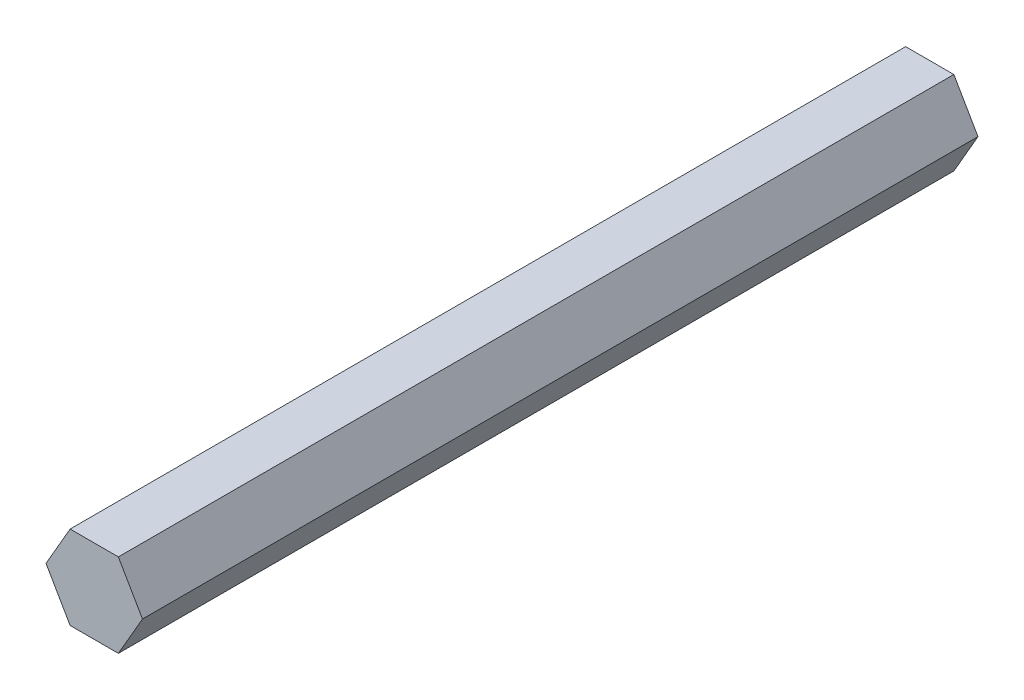
ISO-10303-21;
HEADER;
FILE_DESCRIPTION(('STEP AP214'),'2;1');
FILE_NAME('part.step','',(''),(''),'','','');
FILE_SCHEMA(('AUTOMOTIVE_DESIGN { 1 0 10303 214 1 1 1 1 }'));
ENDSEC;
DATA;
#1=APPLICATION_CONTEXT('core data for automotive mechanical design processes');
#2=APPLICATION_PROTOCOL_DEFINITION('international standard','automotive_design',2000,#1);
#3=PRODUCT_CONTEXT('',#1,'mechanical');
#4=PRODUCT('Part','Part','',(#3));
#5=PRODUCT_RELATED_PRODUCT_CATEGORY('part','',(#4));
#6=PRODUCT_DEFINITION_FORMATION('','',#4);
#7=PRODUCT_DEFINITION_CONTEXT('part definition',#1,'design');
#8=PRODUCT_DEFINITION('design','',#6,#7);
#9=PRODUCT_DEFINITION_SHAPE('','',#8);
#10=(LENGTH_UNIT() NAMED_UNIT(*) SI_UNIT(.MILLI.,.METRE.));
#11=(NAMED_UNIT(*) PLANE_ANGLE_UNIT() SI_UNIT($,.RADIAN.));
#12=(NAMED_UNIT(*) SI_UNIT($,.STERADIAN.) SOLID_ANGLE_UNIT());
#13=UNCERTAINTY_MEASURE_WITH_UNIT(LENGTH_MEASURE(1.E-05),#10,'distance_accuracy_value','');
#14=(GEOMETRIC_REPRESENTATION_CONTEXT(3) GLOBAL_UNCERTAINTY_ASSIGNED_CONTEXT((#13)) GLOBAL_UNIT_ASSIGNED_CONTEXT((#10,
#11,#12)) REPRESENTATION_CONTEXT('',''));
#15=CARTESIAN_POINT('',(0.,0.,0.));
#16=DIRECTION('',(0.,0.,1.));
#17=DIRECTION('',(1.,0.,0.));
#18=AXIS2_PLACEMENT_3D('',#15,#16,#17);
#19=CARTESIAN_POINT('',(3.66617420935412,-6.35,127.));
#20=DIRECTION('',(-0.866025403784439,0.5,0.));
#21=DIRECTION('',(-0.5,-0.866025403784439,0.));
#22=AXIS2_PLACEMENT_3D('',#19,#20,#21);
#23=PLANE('',#22);
#24=DIRECTION('',(0.5,0.866025403784439,0.));
#25=VECTOR('',#24,1.);
#26=CARTESIAN_POINT('',(3.66617420935412,-6.35,0.));
#27=LINE('',#26,#25);
#28=CARTESIAN_POINT('',(3.66617420935412,-6.35,0.));
#29=VERTEX_POINT('',#28);
#30=CARTESIAN_POINT('',(7.33234841870825,0.,0.));
#31=VERTEX_POINT('',#30);
#32=EDGE_CURVE('E139',#29,#31,#27,.T.);
#33=ORIENTED_EDGE('',*,*,#32,.T.);
#34=DIRECTION('',(0.,0.,-1.));
#35=VECTOR('',#34,1.);
#36=CARTESIAN_POINT('',(7.33234841870825,0.,127.));
#37=LINE('',#36,#35);
#38=CARTESIAN_POINT('',(7.33234841870825,0.,127.));
#39=VERTEX_POINT('',#38);
#40=EDGE_CURVE('E11',#39,#31,#37,.T.);
#41=ORIENTED_EDGE('',*,*,#40,.F.);
#42=DIRECTION('',(0.5,0.866025403784439,0.));
#43=VECTOR('',#42,1.);
#44=CARTESIAN_POINT('',(3.66617420935412,-6.35,127.));
#45=LINE('',#44,#43);
#46=CARTESIAN_POINT('',(3.66617420935412,-6.35,127.));
#47=VERTEX_POINT('',#46);
#48=EDGE_CURVE('E149',#47,#39,#45,.T.);
#49=ORIENTED_EDGE('',*,*,#48,.F.);
#50=DIRECTION('',(0.,0.,-1.));
#51=VECTOR('',#50,1.);
#52=CARTESIAN_POINT('',(3.66617420935412,-6.35,127.));
#53=LINE('',#52,#51);
#54=EDGE_CURVE('E135',#47,#29,#53,.T.);
#55=ORIENTED_EDGE('',*,*,#54,.T.);
#56=EDGE_LOOP('',(#33,#41,#49,#55));
#57=FACE_BOUND('',#56,.T.);
#58=ADVANCED_FACE('F43',(#57),#23,.F.);
#59=CARTESIAN_POINT('',(7.33234841870825,0.,127.));
#60=DIRECTION('',(-0.866025403784439,-0.5,0.));
#61=DIRECTION('',(0.5,-0.866025403784439,0.));
#62=AXIS2_PLACEMENT_3D('',#59,#60,#61);
#63=PLANE('',#62);
#64=DIRECTION('',(-0.5,0.866025403784438,0.));
#65=VECTOR('',#64,1.);
#66=CARTESIAN_POINT('',(7.33234841870825,0.,0.));
#67=LINE('',#66,#65);
#68=CARTESIAN_POINT('',(3.66617420935412,6.35,0.));
#69=VERTEX_POINT('',#68);
#70=EDGE_CURVE('E142',#31,#69,#67,.T.);
#71=ORIENTED_EDGE('',*,*,#70,.T.);
#72=DIRECTION('',(0.,0.,-1.));
#73=VECTOR('',#72,1.);
#74=CARTESIAN_POINT('',(3.66617420935412,6.35,127.));
#75=LINE('',#74,#73);
#76=CARTESIAN_POINT('',(3.66617420935412,6.35,127.));
#77=VERTEX_POINT('',#76);
#78=EDGE_CURVE('E52',#77,#69,#75,.T.);
#79=ORIENTED_EDGE('',*,*,#78,.F.);
#80=DIRECTION('',(-0.5,0.866025403784438,0.));
#81=VECTOR('',#80,1.);
#82=CARTESIAN_POINT('',(7.33234841870825,0.,127.));
#83=LINE('',#82,#81);
#84=EDGE_CURVE('E101',#39,#77,#83,.T.);
#85=ORIENTED_EDGE('',*,*,#84,.F.);
#86=ORIENTED_EDGE('',*,*,#40,.T.);
#87=EDGE_LOOP('',(#71,#79,#85,#86));
#88=FACE_BOUND('',#87,.T.);
#89=ADVANCED_FACE('F177',(#88),#63,.F.);
#90=CARTESIAN_POINT('',(3.66617420935412,6.35,127.));
#91=DIRECTION('',(0.,-1.,0.));
#92=DIRECTION('',(1.,0.,0.));
#93=AXIS2_PLACEMENT_3D('',#90,#91,#92);
#94=PLANE('',#93);
#95=DIRECTION('',(-1.,0.,0.));
#96=VECTOR('',#95,1.);
#97=CARTESIAN_POINT('',(3.66617420935412,6.35,0.));
#98=LINE('',#97,#96);
#99=CARTESIAN_POINT('',(-3.66617420935412,6.35,0.));
#100=VERTEX_POINT('',#99);
#101=EDGE_CURVE('E144',#69,#100,#98,.T.);
#102=ORIENTED_EDGE('',*,*,#101,.T.);
#103=DIRECTION('',(0.,0.,-1.));
#104=VECTOR('',#103,1.);
#105=CARTESIAN_POINT('',(-3.66617420935412,6.35,127.));
#106=LINE('',#105,#104);
#107=CARTESIAN_POINT('',(-3.66617420935412,6.35,127.));
#108=VERTEX_POINT('',#107);
#109=EDGE_CURVE('E127',#108,#100,#106,.T.);
#110=ORIENTED_EDGE('',*,*,#109,.F.);
#111=DIRECTION('',(-1.,0.,0.));
#112=VECTOR('',#111,1.);
#113=CARTESIAN_POINT('',(3.66617420935412,6.35,127.));
#114=LINE('',#113,#112);
#115=EDGE_CURVE('E116',#77,#108,#114,.T.);
#116=ORIENTED_EDGE('',*,*,#115,.F.);
#117=ORIENTED_EDGE('',*,*,#78,.T.);
#118=EDGE_LOOP('',(#102,#110,#116,#117));
#119=FACE_BOUND('',#118,.T.);
#120=ADVANCED_FACE('F159',(#119),#94,.F.);
#121=CARTESIAN_POINT('',(-3.66617420935412,6.35,127.));
#122=DIRECTION('',(0.866025403784439,-0.5,0.));
#123=DIRECTION('',(0.5,0.866025403784439,0.));
#124=AXIS2_PLACEMENT_3D('',#121,#122,#123);
#125=PLANE('',#124);
#126=DIRECTION('',(-0.5,-0.866025403784439,0.));
#127=VECTOR('',#126,1.);
#128=CARTESIAN_POINT('',(-3.66617420935412,6.35,0.));
#129=LINE('',#128,#127);
#130=CARTESIAN_POINT('',(-7.33234841870825,0.,0.));
#131=VERTEX_POINT('',#130);
#132=EDGE_CURVE('E125',#100,#131,#129,.T.);
#133=ORIENTED_EDGE('',*,*,#132,.T.);
#134=DIRECTION('',(0.,0.,-1.));
#135=VECTOR('',#134,1.);
#136=CARTESIAN_POINT('',(-7.33234841870825,0.,127.));
#137=LINE('',#136,#135);
#138=CARTESIAN_POINT('',(-7.33234841870825,0.,127.));
#139=VERTEX_POINT('',#138);
#140=EDGE_CURVE('E122',#139,#131,#137,.T.);
#141=ORIENTED_EDGE('',*,*,#140,.F.);
#142=DIRECTION('',(-0.5,-0.866025403784439,0.));
#143=VECTOR('',#142,1.);
#144=CARTESIAN_POINT('',(-3.66617420935412,6.35,127.));
#145=LINE('',#144,#143);
#146=EDGE_CURVE('E110',#108,#139,#145,.T.);
#147=ORIENTED_EDGE('',*,*,#146,.F.);
#148=ORIENTED_EDGE('',*,*,#109,.T.);
#149=EDGE_LOOP('',(#133,#141,#147,#148));
#150=FACE_BOUND('',#149,.T.);
#151=ADVANCED_FACE('F123',(#150),#125,.F.);
#152=CARTESIAN_POINT('',(-7.33234841870825,0.,127.));
#153=DIRECTION('',(0.866025403784438,0.5,0.));
#154=DIRECTION('',(-0.5,0.866025403784439,0.));
#155=AXIS2_PLACEMENT_3D('',#152,#153,#154);
#156=PLANE('',#155);
#157=DIRECTION('',(0.5,-0.866025403784438,0.));
#158=VECTOR('',#157,1.);
#159=CARTESIAN_POINT('',(-7.33234841870825,0.,0.));
#160=LINE('',#159,#158);
#161=CARTESIAN_POINT('',(-3.66617420935412,-6.35,0.));
#162=VERTEX_POINT('',#161);
#163=EDGE_CURVE('E85',#131,#162,#160,.T.);
#164=ORIENTED_EDGE('',*,*,#163,.T.);
#165=DIRECTION('',(0.,0.,-1.));
#166=VECTOR('',#165,1.);
#167=CARTESIAN_POINT('',(-3.66617420935412,-6.35,127.));
#168=LINE('',#167,#166);
#169=CARTESIAN_POINT('',(-3.66617420935412,-6.35,127.));
#170=VERTEX_POINT('',#169);
#171=EDGE_CURVE('E128',#170,#162,#168,.T.);
#172=ORIENTED_EDGE('',*,*,#171,.F.);
#173=DIRECTION('',(0.5,-0.866025403784438,0.));
#174=VECTOR('',#173,1.);
#175=CARTESIAN_POINT('',(-7.33234841870825,0.,127.));
#176=LINE('',#175,#174);
#177=EDGE_CURVE('E114',#139,#170,#176,.T.);
#178=ORIENTED_EDGE('',*,*,#177,.F.);
#179=ORIENTED_EDGE('',*,*,#140,.T.);
#180=EDGE_LOOP('',(#164,#172,#178,#179));
#181=FACE_BOUND('',#180,.T.);
#182=ADVANCED_FACE('F130',(#181),#156,.F.);
#183=CARTESIAN_POINT('',(-3.66617420935412,-6.35,127.));
#184=DIRECTION('',(0.,1.,0.));
#185=DIRECTION('',(0.,0.,1.));
#186=AXIS2_PLACEMENT_3D('',#183,#184,#185);
#187=PLANE('',#186);
#188=DIRECTION('',(1.,0.,0.));
#189=VECTOR('',#188,1.);
#190=CARTESIAN_POINT('',(-3.66617420935412,-6.35,0.));
#191=LINE('',#190,#189);
#192=EDGE_CURVE('E91',#162,#29,#191,.T.);
#193=ORIENTED_EDGE('',*,*,#192,.T.);
#194=ORIENTED_EDGE('',*,*,#54,.F.);
#195=DIRECTION('',(1.,0.,0.));
#196=VECTOR('',#195,1.);
#197=CARTESIAN_POINT('',(-3.66617420935412,-6.35,127.));
#198=LINE('',#197,#196);
#199=EDGE_CURVE('E62',#170,#47,#198,.T.);
#200=ORIENTED_EDGE('',*,*,#199,.F.);
#201=ORIENTED_EDGE('',*,*,#171,.T.);
#202=EDGE_LOOP('',(#193,#194,#200,#201));
#203=FACE_BOUND('',#202,.T.);
#204=ADVANCED_FACE('F166',(#203),#187,.F.);
#205=CARTESIAN_POINT('',(0.,0.,127.));
#206=DIRECTION('',(0.,0.,1.));
#207=DIRECTION('',(1.,0.,0.));
#208=AXIS2_PLACEMENT_3D('',#205,#206,#207);
#209=PLANE('',#208);
#210=ORIENTED_EDGE('',*,*,#48,.T.);
#211=ORIENTED_EDGE('',*,*,#84,.T.);
#212=ORIENTED_EDGE('',*,*,#115,.T.);
#213=ORIENTED_EDGE('',*,*,#146,.T.);
#214=ORIENTED_EDGE('',*,*,#177,.T.);
#215=ORIENTED_EDGE('',*,*,#199,.T.);
#216=EDGE_LOOP('',(#210,#211,#212,#213,#214,#215));
#217=FACE_BOUND('',#216,.T.);
#218=ADVANCED_FACE('F112',(#217),#209,.T.);
#219=CARTESIAN_POINT('',(0.,0.,0.));
#220=DIRECTION('',(0.,0.,1.));
#221=DIRECTION('',(1.,0.,0.));
#222=AXIS2_PLACEMENT_3D('',#219,#220,#221);
#223=PLANE('',#222);
#224=ORIENTED_EDGE('',*,*,#32,.F.);
#225=ORIENTED_EDGE('',*,*,#192,.F.);
#226=ORIENTED_EDGE('',*,*,#163,.F.);
#227=ORIENTED_EDGE('',*,*,#132,.F.);
#228=ORIENTED_EDGE('',*,*,#101,.F.);
#229=ORIENTED_EDGE('',*,*,#70,.F.);
#230=EDGE_LOOP('',(#224,#225,#226,#227,#228,#229));
#231=FACE_BOUND('',#230,.T.);
#232=ADVANCED_FACE('F162',(#231),#223,.F.);
#233=CLOSED_SHELL('',(#58,#89,#120,#151,#182,#204,#218,#232));
#234=MANIFOLD_SOLID_BREP('B2',#233);
#235=ADVANCED_BREP_SHAPE_REPRESENTATION('',(#18,#234),#14);
#236=SHAPE_DEFINITION_REPRESENTATION(#9,#235);
ENDSEC;
END-ISO-10303-21;
